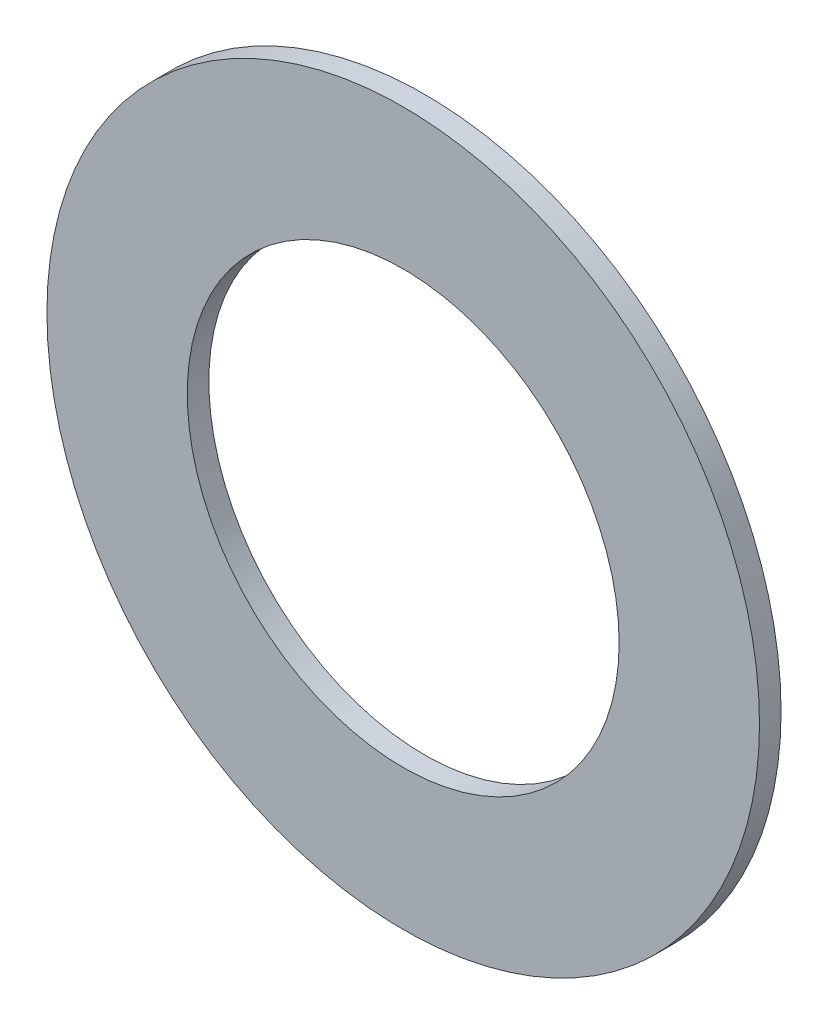
ISO-10303-21;
HEADER;
FILE_DESCRIPTION(('STEP AP214'),'2;1');
FILE_NAME('part.step','',(''),(''),'','','');
FILE_SCHEMA(('AUTOMOTIVE_DESIGN { 1 0 10303 214 1 1 1 1 }'));
ENDSEC;
DATA;
#1=APPLICATION_CONTEXT('core data for automotive mechanical design processes');
#2=APPLICATION_PROTOCOL_DEFINITION('international standard','automotive_design',2000,#1);
#3=PRODUCT_CONTEXT('',#1,'mechanical');
#4=PRODUCT('Part','Part','',(#3));
#5=PRODUCT_RELATED_PRODUCT_CATEGORY('part','',(#4));
#6=PRODUCT_DEFINITION_FORMATION('','',#4);
#7=PRODUCT_DEFINITION_CONTEXT('part definition',#1,'design');
#8=PRODUCT_DEFINITION('design','',#6,#7);
#9=PRODUCT_DEFINITION_SHAPE('','',#8);
#10=(LENGTH_UNIT() NAMED_UNIT(*) SI_UNIT(.MILLI.,.METRE.));
#11=(NAMED_UNIT(*) PLANE_ANGLE_UNIT() SI_UNIT($,.RADIAN.));
#12=(NAMED_UNIT(*) SI_UNIT($,.STERADIAN.) SOLID_ANGLE_UNIT());
#13=UNCERTAINTY_MEASURE_WITH_UNIT(LENGTH_MEASURE(1.E-05),#10,'distance_accuracy_value','');
#14=(GEOMETRIC_REPRESENTATION_CONTEXT(3) GLOBAL_UNCERTAINTY_ASSIGNED_CONTEXT((#13)) GLOBAL_UNIT_ASSIGNED_CONTEXT((#10,
#11,#12)) REPRESENTATION_CONTEXT('',''));
#15=CARTESIAN_POINT('',(0.,0.,0.));
#16=DIRECTION('',(0.,0.,1.));
#17=DIRECTION('',(1.,0.,0.));
#18=AXIS2_PLACEMENT_3D('',#15,#16,#17);
#19=CARTESIAN_POINT('',(0.,0.,1.));
#20=DIRECTION('',(0.,0.,-1.));
#21=DIRECTION('',(-1.,0.,0.));
#22=AXIS2_PLACEMENT_3D('',#19,#20,#21);
#23=CYLINDRICAL_SURFACE('',#22,16.5);
#24=CARTESIAN_POINT('',(0.,0.,1.));
#25=DIRECTION('',(0.,0.,1.));
#26=DIRECTION('',(1.,0.,0.));
#27=AXIS2_PLACEMENT_3D('',#24,#25,#26);
#28=CIRCLE('',#27,16.5);
#29=CARTESIAN_POINT('',(16.5,0.,1.));
#30=VERTEX_POINT('',#29);
#31=EDGE_CURVE('E10',#30,#30,#28,.T.);
#32=ORIENTED_EDGE('',*,*,#31,.F.);
#33=EDGE_LOOP('',(#32));
#34=FACE_BOUND('',#33,.T.);
#35=CARTESIAN_POINT('',(0.,0.,0.));
#36=DIRECTION('',(0.,0.,1.));
#37=DIRECTION('',(1.,0.,0.));
#38=AXIS2_PLACEMENT_3D('',#35,#36,#37);
#39=CIRCLE('',#38,16.5);
#40=CARTESIAN_POINT('',(16.5,0.,0.));
#41=VERTEX_POINT('',#40);
#42=EDGE_CURVE('E41',#41,#41,#39,.T.);
#43=ORIENTED_EDGE('',*,*,#42,.T.);
#44=EDGE_LOOP('',(#43));
#45=FACE_BOUND('',#44,.T.);
#46=ADVANCED_FACE('F34',(#34,#45),#23,.T.);
#47=CARTESIAN_POINT('',(0.,0.,1.));
#48=DIRECTION('',(0.,0.,1.));
#49=DIRECTION('',(1.,0.,0.));
#50=AXIS2_PLACEMENT_3D('',#47,#48,#49);
#51=PLANE('',#50);
#52=CARTESIAN_POINT('',(0.,0.,1.));
#53=DIRECTION('',(0.,0.,1.));
#54=DIRECTION('',(1.,0.,0.));
#55=AXIS2_PLACEMENT_3D('',#52,#53,#54);
#56=CIRCLE('',#55,10.);
#57=CARTESIAN_POINT('',(10.,0.,1.));
#58=VERTEX_POINT('',#57);
#59=EDGE_CURVE('E47',#58,#58,#56,.T.);
#60=ORIENTED_EDGE('',*,*,#59,.F.);
#61=EDGE_LOOP('',(#60));
#62=FACE_BOUND('',#61,.T.);
#63=ORIENTED_EDGE('',*,*,#31,.T.);
#64=EDGE_LOOP('',(#63));
#65=FACE_BOUND('',#64,.T.);
#66=ADVANCED_FACE('F63',(#62,#65),#51,.T.);
#67=CARTESIAN_POINT('',(0.,0.,0.));
#68=DIRECTION('',(0.,0.,1.));
#69=DIRECTION('',(1.,0.,0.));
#70=AXIS2_PLACEMENT_3D('',#67,#68,#69);
#71=PLANE('',#70);
#72=CARTESIAN_POINT('',(0.,0.,0.));
#73=DIRECTION('',(0.,0.,1.));
#74=DIRECTION('',(1.,0.,0.));
#75=AXIS2_PLACEMENT_3D('',#72,#73,#74);
#76=CIRCLE('',#75,10.);
#77=CARTESIAN_POINT('',(10.,0.,0.));
#78=VERTEX_POINT('',#77);
#79=EDGE_CURVE('E37',#78,#78,#76,.T.);
#80=ORIENTED_EDGE('',*,*,#79,.T.);
#81=EDGE_LOOP('',(#80));
#82=FACE_BOUND('',#81,.T.);
#83=ORIENTED_EDGE('',*,*,#42,.F.);
#84=EDGE_LOOP('',(#83));
#85=FACE_BOUND('',#84,.T.);
#86=ADVANCED_FACE('F54',(#82,#85),#71,.F.);
#87=CARTESIAN_POINT('',(0.,0.,-1.2E-05));
#88=DIRECTION('',(0.,0.,1.));
#89=DIRECTION('',(1.,0.,0.));
#90=AXIS2_PLACEMENT_3D('',#87,#88,#89);
#91=CYLINDRICAL_SURFACE('',#90,10.);
#92=CARTESIAN_POINT('',(10.,0.,1.));
#93=CARTESIAN_POINT('',(10.,0.,0.989583333333333));
#94=CARTESIAN_POINT('',(10.,0.,0.979166666666667));
#95=CARTESIAN_POINT('',(10.,0.,0.958333333333333));
#96=CARTESIAN_POINT('',(10.,0.,0.947916666666667));
#97=CARTESIAN_POINT('',(10.,0.,0.927083333333333));
#98=CARTESIAN_POINT('',(10.,0.,0.916666666666667));
#99=CARTESIAN_POINT('',(10.,0.,0.895833333333333));
#100=CARTESIAN_POINT('',(10.,0.,0.885416666666667));
#101=CARTESIAN_POINT('',(10.,0.,0.864583333333333));
#102=CARTESIAN_POINT('',(10.,0.,0.854166666666667));
#103=CARTESIAN_POINT('',(10.,0.,0.833333333333333));
#104=CARTESIAN_POINT('',(10.,0.,0.822916666666667));
#105=CARTESIAN_POINT('',(10.,0.,0.802083333333333));
#106=CARTESIAN_POINT('',(10.,0.,0.791666666666667));
#107=CARTESIAN_POINT('',(10.,0.,0.770833333333333));
#108=CARTESIAN_POINT('',(10.,0.,0.760416666666667));
#109=CARTESIAN_POINT('',(10.,0.,0.739583333333333));
#110=CARTESIAN_POINT('',(10.,0.,0.729166666666667));
#111=CARTESIAN_POINT('',(10.,0.,0.708333333333333));
#112=CARTESIAN_POINT('',(10.,0.,0.697916666666667));
#113=CARTESIAN_POINT('',(10.,0.,0.677083333333333));
#114=CARTESIAN_POINT('',(10.,0.,0.666666666666667));
#115=CARTESIAN_POINT('',(10.,0.,0.645833333333333));
#116=CARTESIAN_POINT('',(10.,0.,0.635416666666667));
#117=CARTESIAN_POINT('',(10.,0.,0.614583333333333));
#118=CARTESIAN_POINT('',(10.,0.,0.604166666666667));
#119=CARTESIAN_POINT('',(10.,0.,0.583333333333333));
#120=CARTESIAN_POINT('',(10.,0.,0.572916666666667));
#121=CARTESIAN_POINT('',(10.,0.,0.552083333333333));
#122=CARTESIAN_POINT('',(10.,0.,0.541666666666667));
#123=CARTESIAN_POINT('',(10.,0.,0.520833333333333));
#124=CARTESIAN_POINT('',(10.,0.,0.510416666666667));
#125=CARTESIAN_POINT('',(10.,0.,0.489583333333333));
#126=CARTESIAN_POINT('',(10.,0.,0.479166666666667));
#127=CARTESIAN_POINT('',(10.,0.,0.458333333333333));
#128=CARTESIAN_POINT('',(10.,0.,0.447916666666667));
#129=CARTESIAN_POINT('',(10.,0.,0.427083333333333));
#130=CARTESIAN_POINT('',(10.,0.,0.416666666666667));
#131=CARTESIAN_POINT('',(10.,0.,0.395833333333333));
#132=CARTESIAN_POINT('',(10.,0.,0.385416666666667));
#133=CARTESIAN_POINT('',(10.,0.,0.364583333333333));
#134=CARTESIAN_POINT('',(10.,0.,0.354166666666667));
#135=CARTESIAN_POINT('',(10.,0.,0.333333333333333));
#136=CARTESIAN_POINT('',(10.,0.,0.322916666666667));
#137=CARTESIAN_POINT('',(10.,0.,0.302083333333333));
#138=CARTESIAN_POINT('',(10.,0.,0.291666666666667));
#139=CARTESIAN_POINT('',(10.,0.,0.270833333333333));
#140=CARTESIAN_POINT('',(10.,0.,0.260416666666667));
#141=CARTESIAN_POINT('',(10.,0.,0.239583333333333));
#142=CARTESIAN_POINT('',(10.,0.,0.229166666666667));
#143=CARTESIAN_POINT('',(10.,0.,0.208333333333333));
#144=CARTESIAN_POINT('',(10.,0.,0.197916666666667));
#145=CARTESIAN_POINT('',(10.,0.,0.177083333333333));
#146=CARTESIAN_POINT('',(10.,0.,0.166666666666667));
#147=CARTESIAN_POINT('',(10.,0.,0.145833333333333));
#148=CARTESIAN_POINT('',(10.,0.,0.135416666666667));
#149=CARTESIAN_POINT('',(10.,0.,0.114583333333333));
#150=CARTESIAN_POINT('',(10.,0.,0.104166666666667));
#151=CARTESIAN_POINT('',(10.,0.,0.0833333333333333));
#152=CARTESIAN_POINT('',(10.,0.,0.0729166666666667));
#153=CARTESIAN_POINT('',(10.,0.,0.0520833333333333));
#154=CARTESIAN_POINT('',(10.,0.,0.0416666666666667));
#155=CARTESIAN_POINT('',(10.,0.,0.0208333333333333));
#156=CARTESIAN_POINT('',(10.,0.,0.0104166666666666));
#157=CARTESIAN_POINT('',(10.,0.,0.));
#158=B_SPLINE_CURVE_WITH_KNOTS('',3,(#92,#93,#94,#95,#96,#97,#98,#99,#100,#101,#102,#103,#104,
#105,#106,#107,#108,#109,#110,#111,#112,#113,#114,#115,#116,#117,#118,#119,#120,#121,#122,#123,
#124,#125,#126,#127,#128,#129,#130,#131,#132,#133,#134,#135,#136,#137,#138,#139,#140,#141,#142,
#143,#144,#145,#146,#147,#148,#149,#150,#151,#152,#153,#154,#155,#156,#157),.UNSPECIFIED.,.F.,
.F.,(4,2,2,2,2,2,2,2,2,2,2,2,2,2,2,2,2,2,2,2,2,2,2,2,2,2,2,2,2,2,2,2,4),(0.,0.0312499999999999,
0.0624999999999999,0.09375,0.125,0.15625,0.1875,0.21875,0.25,0.28125,0.3125,0.34375,0.375,
0.40625,0.4375,0.46875,0.5,0.53125,0.5625,0.59375,0.625,0.65625,0.6875,0.71875,0.75,0.78125,
0.8125,0.84375,0.875,0.90625,0.9375,0.96875,1.),.UNSPECIFIED.);
#159=EDGE_CURVE('BSEAM57',#58,#78,#158,.T.);
#160=ORIENTED_EDGE('',*,*,#59,.T.);
#161=ORIENTED_EDGE('',*,*,#79,.F.);
#162=ORIENTED_EDGE('',*,*,#159,.T.);
#163=ORIENTED_EDGE('',*,*,#159,.F.);
#164=EDGE_LOOP('',(#160,#162,#161,#163));
#165=FACE_BOUND('',#164,.T.);
#166=ADVANCED_FACE('F57',(#165),#91,.F.);
#167=CLOSED_SHELL('',(#46,#66,#86,#166));
#168=MANIFOLD_SOLID_BREP('B2',#167);
#169=ADVANCED_BREP_SHAPE_REPRESENTATION('',(#18,#168),#14);
#170=SHAPE_DEFINITION_REPRESENTATION(#9,#169);
ENDSEC;
END-ISO-10303-21;
